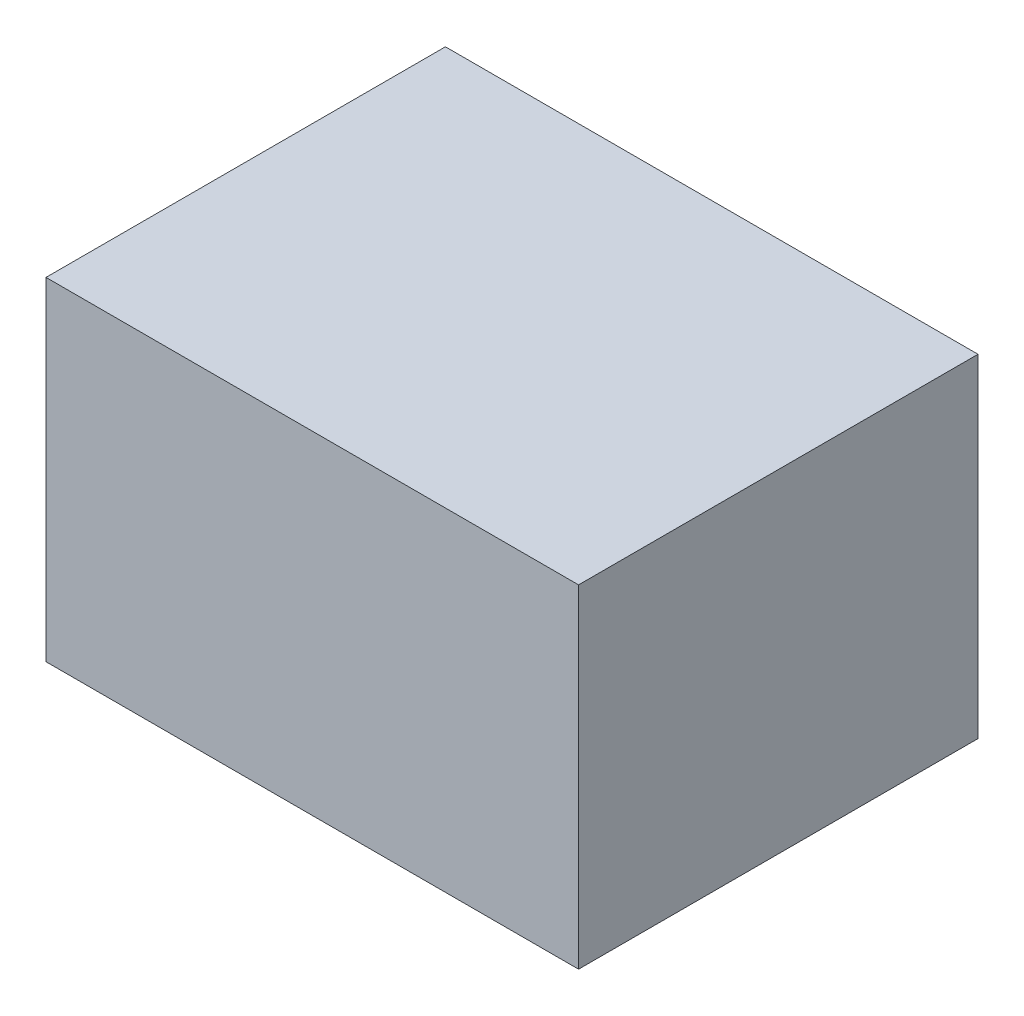
ISO-10303-21;
HEADER;
FILE_DESCRIPTION(('STEP AP214'),'2;1');
FILE_NAME('part.step','',(''),(''),'','','');
FILE_SCHEMA(('AUTOMOTIVE_DESIGN { 1 0 10303 214 1 1 1 1 }'));
ENDSEC;
DATA;
#1=APPLICATION_CONTEXT('core data for automotive mechanical design processes');
#2=APPLICATION_PROTOCOL_DEFINITION('international standard','automotive_design',2000,#1);
#3=PRODUCT_CONTEXT('',#1,'mechanical');
#4=PRODUCT('Part','Part','',(#3));
#5=PRODUCT_RELATED_PRODUCT_CATEGORY('part','',(#4));
#6=PRODUCT_DEFINITION_FORMATION('','',#4);
#7=PRODUCT_DEFINITION_CONTEXT('part definition',#1,'design');
#8=PRODUCT_DEFINITION('design','',#6,#7);
#9=PRODUCT_DEFINITION_SHAPE('','',#8);
#10=(LENGTH_UNIT() NAMED_UNIT(*) SI_UNIT(.MILLI.,.METRE.));
#11=(NAMED_UNIT(*) PLANE_ANGLE_UNIT() SI_UNIT($,.RADIAN.));
#12=(NAMED_UNIT(*) SI_UNIT($,.STERADIAN.) SOLID_ANGLE_UNIT());
#13=UNCERTAINTY_MEASURE_WITH_UNIT(LENGTH_MEASURE(1.E-05),#10,'distance_accuracy_value','');
#14=(GEOMETRIC_REPRESENTATION_CONTEXT(3) GLOBAL_UNCERTAINTY_ASSIGNED_CONTEXT((#13)) GLOBAL_UNIT_ASSIGNED_CONTEXT((#10,
#11,#12)) REPRESENTATION_CONTEXT('',''));
#15=CARTESIAN_POINT('',(0.,0.,0.));
#16=DIRECTION('',(0.,0.,1.));
#17=DIRECTION('',(1.,0.,0.));
#18=AXIS2_PLACEMENT_3D('',#15,#16,#17);
#19=CARTESIAN_POINT('',(0.999997999999997,-0.6500114,1.499997));
#20=DIRECTION('',(0.,1.,0.));
#21=DIRECTION('',(0.,0.,1.));
#22=AXIS2_PLACEMENT_3D('',#19,#20,#21);
#23=PLANE('',#22);
#24=DIRECTION('',(1.,0.,0.));
#25=VECTOR('',#24,1.);
#26=CARTESIAN_POINT('',(0.999997999999997,-0.6500114,0.));
#27=LINE('',#26,#25);
#28=CARTESIAN_POINT('',(-0.999997999999997,-0.6500114,0.));
#29=VERTEX_POINT('',#28);
#30=CARTESIAN_POINT('',(0.999997999999997,-0.6500114,0.));
#31=VERTEX_POINT('',#30);
#32=EDGE_CURVE('E95',#29,#31,#27,.T.);
#33=ORIENTED_EDGE('',*,*,#32,.T.);
#34=DIRECTION('',(0.,0.,-1.));
#35=VECTOR('',#34,1.);
#36=CARTESIAN_POINT('',(0.999997999999997,-0.6500114,1.499997));
#37=LINE('',#36,#35);
#38=CARTESIAN_POINT('',(0.999997999999997,-0.6500114,1.499997));
#39=VERTEX_POINT('',#38);
#40=EDGE_CURVE('E11',#39,#31,#37,.T.);
#41=ORIENTED_EDGE('',*,*,#40,.F.);
#42=DIRECTION('',(1.,0.,0.));
#43=VECTOR('',#42,1.);
#44=CARTESIAN_POINT('',(0.999997999999997,-0.6500114,1.499997));
#45=LINE('',#44,#43);
#46=CARTESIAN_POINT('',(-0.999997999999997,-0.6500114,1.499997));
#47=VERTEX_POINT('',#46);
#48=EDGE_CURVE('E83',#47,#39,#45,.T.);
#49=ORIENTED_EDGE('',*,*,#48,.F.);
#50=DIRECTION('',(0.,0.,-1.));
#51=VECTOR('',#50,1.);
#52=CARTESIAN_POINT('',(-0.999997999999997,-0.6500114,1.499997));
#53=LINE('',#52,#51);
#54=EDGE_CURVE('E91',#47,#29,#53,.T.);
#55=ORIENTED_EDGE('',*,*,#54,.T.);
#56=EDGE_LOOP('',(#33,#41,#49,#55));
#57=FACE_BOUND('',#56,.T.);
#58=ADVANCED_FACE('F32',(#57),#23,.F.);
#59=CARTESIAN_POINT('',(0.999997999999997,0.599998799999999,1.499997));
#60=DIRECTION('',(-1.,0.,0.));
#61=DIRECTION('',(0.,0.,1.));
#62=AXIS2_PLACEMENT_3D('',#59,#60,#61);
#63=PLANE('',#62);
#64=DIRECTION('',(0.,1.,0.));
#65=VECTOR('',#64,1.);
#66=CARTESIAN_POINT('',(0.999997999999997,0.599998799999999,0.));
#67=LINE('',#66,#65);
#68=CARTESIAN_POINT('',(0.999997999999997,0.599998799999999,0.));
#69=VERTEX_POINT('',#68);
#70=EDGE_CURVE('E87',#31,#69,#67,.T.);
#71=ORIENTED_EDGE('',*,*,#70,.T.);
#72=DIRECTION('',(0.,0.,-1.));
#73=VECTOR('',#72,1.);
#74=CARTESIAN_POINT('',(0.999997999999997,0.599998799999999,1.499997));
#75=LINE('',#74,#73);
#76=CARTESIAN_POINT('',(0.999997999999997,0.599998799999999,1.499997));
#77=VERTEX_POINT('',#76);
#78=EDGE_CURVE('E40',#77,#69,#75,.T.);
#79=ORIENTED_EDGE('',*,*,#78,.F.);
#80=DIRECTION('',(0.,1.,0.));
#81=VECTOR('',#80,1.);
#82=CARTESIAN_POINT('',(0.999997999999997,0.599998799999999,1.499997));
#83=LINE('',#82,#81);
#84=EDGE_CURVE('E78',#39,#77,#83,.T.);
#85=ORIENTED_EDGE('',*,*,#84,.F.);
#86=ORIENTED_EDGE('',*,*,#40,.T.);
#87=EDGE_LOOP('',(#71,#79,#85,#86));
#88=FACE_BOUND('',#87,.T.);
#89=ADVANCED_FACE('F86',(#88),#63,.F.);
#90=CARTESIAN_POINT('',(-0.999997999999997,0.599998799999999,1.499997));
#91=DIRECTION('',(0.,-1.,0.));
#92=DIRECTION('',(0.,0.,-1.));
#93=AXIS2_PLACEMENT_3D('',#90,#91,#92);
#94=PLANE('',#93);
#95=DIRECTION('',(-1.,0.,0.));
#96=VECTOR('',#95,1.);
#97=CARTESIAN_POINT('',(-0.999997999999997,0.599998799999999,0.));
#98=LINE('',#97,#96);
#99=CARTESIAN_POINT('',(-0.999997999999997,0.599998799999999,0.));
#100=VERTEX_POINT('',#99);
#101=EDGE_CURVE('E65',#69,#100,#98,.T.);
#102=ORIENTED_EDGE('',*,*,#101,.T.);
#103=DIRECTION('',(0.,0.,-1.));
#104=VECTOR('',#103,1.);
#105=CARTESIAN_POINT('',(-0.999997999999997,0.599998799999999,1.499997));
#106=LINE('',#105,#104);
#107=CARTESIAN_POINT('',(-0.999997999999997,0.599998799999999,1.499997));
#108=VERTEX_POINT('',#107);
#109=EDGE_CURVE('E88',#108,#100,#106,.T.);
#110=ORIENTED_EDGE('',*,*,#109,.F.);
#111=DIRECTION('',(-1.,0.,0.));
#112=VECTOR('',#111,1.);
#113=CARTESIAN_POINT('',(-0.999997999999997,0.599998799999999,1.499997));
#114=LINE('',#113,#112);
#115=EDGE_CURVE('E81',#77,#108,#114,.T.);
#116=ORIENTED_EDGE('',*,*,#115,.F.);
#117=ORIENTED_EDGE('',*,*,#78,.T.);
#118=EDGE_LOOP('',(#102,#110,#116,#117));
#119=FACE_BOUND('',#118,.T.);
#120=ADVANCED_FACE('F89',(#119),#94,.F.);
#121=CARTESIAN_POINT('',(-0.999997999999997,-0.6500114,1.499997));
#122=DIRECTION('',(1.,0.,0.));
#123=DIRECTION('',(0.,0.,-1.));
#124=AXIS2_PLACEMENT_3D('',#121,#122,#123);
#125=PLANE('',#124);
#126=DIRECTION('',(0.,-1.,0.));
#127=VECTOR('',#126,1.);
#128=CARTESIAN_POINT('',(-0.999997999999997,-0.6500114,0.));
#129=LINE('',#128,#127);
#130=EDGE_CURVE('E71',#100,#29,#129,.T.);
#131=ORIENTED_EDGE('',*,*,#130,.T.);
#132=ORIENTED_EDGE('',*,*,#54,.F.);
#133=DIRECTION('',(0.,-1.,0.));
#134=VECTOR('',#133,1.);
#135=CARTESIAN_POINT('',(-0.999997999999997,-0.6500114,1.499997));
#136=LINE('',#135,#134);
#137=EDGE_CURVE('E48',#108,#47,#136,.T.);
#138=ORIENTED_EDGE('',*,*,#137,.F.);
#139=ORIENTED_EDGE('',*,*,#109,.T.);
#140=EDGE_LOOP('',(#131,#132,#138,#139));
#141=FACE_BOUND('',#140,.T.);
#142=ADVANCED_FACE('F102',(#141),#125,.F.);
#143=CARTESIAN_POINT('',(0.,0.,1.499997));
#144=DIRECTION('',(0.,0.,-1.));
#145=DIRECTION('',(-1.,0.,0.));
#146=AXIS2_PLACEMENT_3D('',#143,#144,#145);
#147=PLANE('',#146);
#148=ORIENTED_EDGE('',*,*,#48,.T.);
#149=ORIENTED_EDGE('',*,*,#84,.T.);
#150=ORIENTED_EDGE('',*,*,#115,.T.);
#151=ORIENTED_EDGE('',*,*,#137,.T.);
#152=EDGE_LOOP('',(#148,#149,#150,#151));
#153=FACE_BOUND('',#152,.T.);
#154=ADVANCED_FACE('F79',(#153),#147,.F.);
#155=CARTESIAN_POINT('',(0.,0.,0.));
#156=DIRECTION('',(0.,0.,-1.));
#157=DIRECTION('',(-1.,0.,0.));
#158=AXIS2_PLACEMENT_3D('',#155,#156,#157);
#159=PLANE('',#158);
#160=ORIENTED_EDGE('',*,*,#32,.F.);
#161=ORIENTED_EDGE('',*,*,#130,.F.);
#162=ORIENTED_EDGE('',*,*,#101,.F.);
#163=ORIENTED_EDGE('',*,*,#70,.F.);
#164=EDGE_LOOP('',(#160,#161,#162,#163));
#165=FACE_BOUND('',#164,.T.);
#166=ADVANCED_FACE('F105',(#165),#159,.T.);
#167=CLOSED_SHELL('',(#58,#89,#120,#142,#154,#166));
#168=MANIFOLD_SOLID_BREP('B2',#167);
#169=ADVANCED_BREP_SHAPE_REPRESENTATION('',(#18,#168),#14);
#170=SHAPE_DEFINITION_REPRESENTATION(#9,#169);
ENDSEC;
END-ISO-10303-21;
